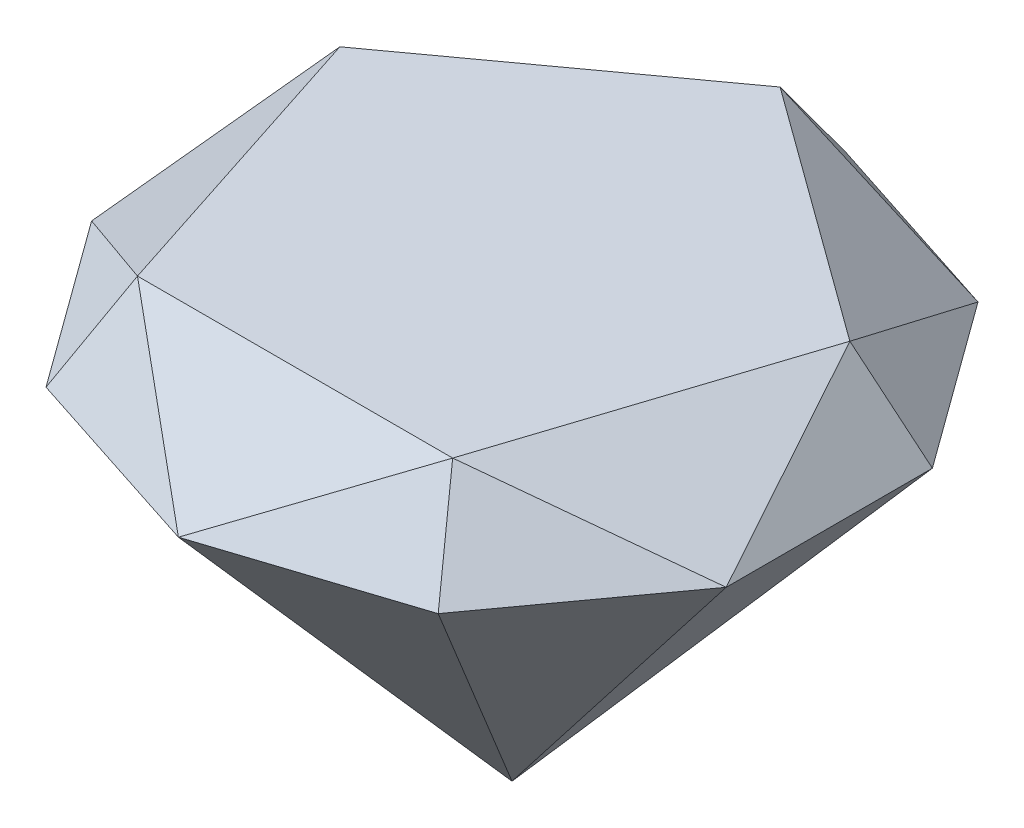
ISO-10303-21;
HEADER;
FILE_DESCRIPTION(('STEP AP214'),'2;1');
FILE_NAME('part.step','',(''),(''),'','','');
FILE_SCHEMA(('AUTOMOTIVE_DESIGN { 1 0 10303 214 1 1 1 1 }'));
ENDSEC;
DATA;
#1=APPLICATION_CONTEXT('core data for automotive mechanical design processes');
#2=APPLICATION_PROTOCOL_DEFINITION('international standard','automotive_design',2000,#1);
#3=PRODUCT_CONTEXT('',#1,'mechanical');
#4=PRODUCT('Part','Part','',(#3));
#5=PRODUCT_RELATED_PRODUCT_CATEGORY('part','',(#4));
#6=PRODUCT_DEFINITION_FORMATION('','',#4);
#7=PRODUCT_DEFINITION_CONTEXT('part definition',#1,'design');
#8=PRODUCT_DEFINITION('design','',#6,#7);
#9=PRODUCT_DEFINITION_SHAPE('','',#8);
#10=(LENGTH_UNIT() NAMED_UNIT(*) SI_UNIT(.MILLI.,.METRE.));
#11=(NAMED_UNIT(*) PLANE_ANGLE_UNIT() SI_UNIT($,.RADIAN.));
#12=(NAMED_UNIT(*) SI_UNIT($,.STERADIAN.) SOLID_ANGLE_UNIT());
#13=UNCERTAINTY_MEASURE_WITH_UNIT(LENGTH_MEASURE(1.E-05),#10,'distance_accuracy_value','');
#14=(GEOMETRIC_REPRESENTATION_CONTEXT(3) GLOBAL_UNCERTAINTY_ASSIGNED_CONTEXT((#13)) GLOBAL_UNIT_ASSIGNED_CONTEXT((#10,
#11,#12)) REPRESENTATION_CONTEXT('',''));
#15=CARTESIAN_POINT('',(0.,0.,0.));
#16=DIRECTION('',(0.,0.,1.));
#17=DIRECTION('',(1.,0.,0.));
#18=AXIS2_PLACEMENT_3D('',#15,#16,#17);
#19=CARTESIAN_POINT('',(-2.41729459493997E-13,85.0068765041162,0.));
#20=DIRECTION('',(0.,-1.,0.));
#21=DIRECTION('',(0.,0.,1.));
#22=AXIS2_PLACEMENT_3D('',#19,#20,#21);
#23=PLANE('',#22);
#24=DIRECTION('',(-0.809016994374936,0.,-0.587785252292489));
#25=VECTOR('',#24,1.);
#26=CARTESIAN_POINT('',(8.99718587698742E-13,85.0068765041162,-60.2751644889123));
#27=LINE('',#26,#25);
#28=CARTESIAN_POINT('',(57.3250879579424,85.0068765041166,-18.6260501658181));
#29=VERTEX_POINT('',#28);
#30=CARTESIAN_POINT('',(8.99718587698742E-13,85.0068765041162,-60.2751644889123));
#31=VERTEX_POINT('',#30);
#32=EDGE_CURVE('E115',#29,#31,#27,.T.);
#33=ORIENTED_EDGE('',*,*,#32,.T.);
#34=DIRECTION('',(-0.809016994374957,0.,0.587785252292459));
#35=VECTOR('',#34,1.);
#36=CARTESIAN_POINT('',(-57.3250879579423,85.0068765041158,-18.6260501658202));
#37=LINE('',#36,#35);
#38=CARTESIAN_POINT('',(-57.3250879579423,85.0068765041158,-18.6260501658201));
#39=VERTEX_POINT('',#38);
#40=EDGE_CURVE('E128',#31,#39,#37,.T.);
#41=ORIENTED_EDGE('',*,*,#40,.T.);
#42=DIRECTION('',(0.309016994374934,0.,0.951056516295158));
#43=VECTOR('',#42,1.);
#44=CARTESIAN_POINT('',(-35.4288527660865,85.006876504116,48.763632410275));
#45=LINE('',#44,#43);
#46=CARTESIAN_POINT('',(-35.4288527660865,85.006876504116,48.763632410275));
#47=VERTEX_POINT('',#46);
#48=EDGE_CURVE('E238',#39,#47,#45,.T.);
#49=ORIENTED_EDGE('',*,*,#48,.T.);
#50=DIRECTION('',(1.,0.,0.));
#51=VECTOR('',#50,1.);
#52=CARTESIAN_POINT('',(35.4288527660849,85.0068765041164,48.7636324102758));
#53=LINE('',#52,#51);
#54=CARTESIAN_POINT('',(35.4288527660849,85.0068765041164,48.7636324102758));
#55=VERTEX_POINT('',#54);
#56=EDGE_CURVE('E151',#47,#55,#53,.T.);
#57=ORIENTED_EDGE('',*,*,#56,.T.);
#58=DIRECTION('',(0.309016994374955,0.,-0.951056516295151));
#59=VECTOR('',#58,1.);
#60=CARTESIAN_POINT('',(57.3250879579422,85.0068765041166,-18.6260501658188));
#61=LINE('',#60,#59);
#62=EDGE_CURVE('E132',#55,#29,#61,.T.);
#63=ORIENTED_EDGE('',*,*,#62,.T.);
#64=EDGE_LOOP('',(#33,#41,#49,#57,#63));
#65=FACE_BOUND('',#64,.T.);
#66=ADVANCED_FACE('F45',(#65),#23,.F.);
#67=CARTESIAN_POINT('',(44.0838939219359,65.0068765041165,-60.6762745781206));
#68=DIRECTION('',(0.662707924806773,0.573576436351051,-0.481485491018295));
#69=DIRECTION('',(-0.654428408218345,0.756123970336084,0.));
#70=AXIS2_PLACEMENT_3D('',#67,#68,#69);
#71=PLANE('',#70);
#72=DIRECTION('',(0.587785252292467,0.,0.809016994374952));
#73=VECTOR('',#72,1.);
#74=CARTESIAN_POINT('',(44.0838939219359,65.0068765041165,-60.6762745781206));
#75=LINE('',#74,#73);
#76=CARTESIAN_POINT('',(44.0838939219359,65.0068765041165,-60.6762745781206));
#77=VERTEX_POINT('',#76);
#78=CARTESIAN_POINT('',(71.3292387221366,65.0068765041167,-23.1762745781205));
#79=VERTEX_POINT('',#78);
#80=EDGE_CURVE('E180',#77,#79,#75,.T.);
#81=ORIENTED_EDGE('',*,*,#80,.F.);
#82=DIRECTION('',(0.273520563799857,0.413135798865409,0.868622652752303));
#83=VECTOR('',#82,1.);
#84=CARTESIAN_POINT('',(57.3250879579424,85.0068765041166,-18.6260501658181));
#85=LINE('',#84,#83);
#86=EDGE_CURVE('E117',#77,#29,#85,.T.);
#87=ORIENTED_EDGE('',*,*,#86,.T.);
#88=DIRECTION('',(0.563867779944973,-0.8052866459945,-0.183211747775237));
#89=VECTOR('',#88,1.);
#90=CARTESIAN_POINT('',(66.5406865874401,71.845637690464,-21.6203796731195));
#91=LINE('',#90,#89);
#92=EDGE_CURVE('E157',#29,#79,#91,.T.);
#93=ORIENTED_EDGE('',*,*,#92,.T.);
#94=EDGE_LOOP('',(#81,#87,#93));
#95=FACE_BOUND('',#94,.T.);
#96=ADVANCED_FACE('F242',(#95),#71,.T.);
#97=CARTESIAN_POINT('',(4.90895196335173E-13,65.0068765041162,-75.));
#98=DIRECTION('',(0.253131902662281,0.573576436351048,-0.779059889557539));
#99=DIRECTION('',(0.,-0.805286645994503,-0.592885670077229));
#100=AXIS2_PLACEMENT_3D('',#97,#98,#99);
#101=PLANE('',#100);
#102=DIRECTION('',(0.,-0.805286645994503,-0.592885670077228));
#103=VECTOR('',#102,1.);
#104=CARTESIAN_POINT('',(3.98347598342526E-13,71.8456376904636,-69.9650183215712));
#105=LINE('',#104,#103);
#106=CARTESIAN_POINT('',(4.90895196335173E-13,65.0068765041162,-75.));
#107=VERTEX_POINT('',#106);
#108=EDGE_CURVE('E147',#31,#107,#105,.T.);
#109=ORIENTED_EDGE('',*,*,#108,.F.);
#110=DIRECTION('',(0.910631736626837,-0.413135798865401,-0.00828564685689326));
#111=VECTOR('',#110,1.);
#112=CARTESIAN_POINT('',(44.0838939219366,65.0068765041165,-60.6762745781202));
#113=LINE('',#112,#111);
#114=EDGE_CURVE('E112',#31,#77,#113,.T.);
#115=ORIENTED_EDGE('',*,*,#114,.T.);
#116=DIRECTION('',(0.951056516295151,0.,0.309016994374956));
#117=VECTOR('',#116,1.);
#118=CARTESIAN_POINT('',(4.90895196335173E-13,65.0068765041162,-75.));
#119=LINE('',#118,#117);
#120=EDGE_CURVE('E155',#107,#77,#119,.T.);
#121=ORIENTED_EDGE('',*,*,#120,.F.);
#122=EDGE_LOOP('',(#109,#115,#121));
#123=FACE_BOUND('',#122,.T.);
#124=ADVANCED_FACE('F153',(#123),#101,.T.);
#125=CARTESIAN_POINT('',(-71.3292387221368,65.0068765041157,23.1762745781204));
#126=DIRECTION('',(-0.819152044288995,0.573576436351041,0.));
#127=DIRECTION('',(-0.573576436351041,-0.819152044288995,0.));
#128=AXIS2_PLACEMENT_3D('',#125,#126,#127);
#129=PLANE('',#128);
#130=DIRECTION('',(0.,0.,-1.));
#131=VECTOR('',#130,1.);
#132=CARTESIAN_POINT('',(-71.3292387221368,65.0068765041157,23.1762745781204));
#133=LINE('',#132,#131);
#134=CARTESIAN_POINT('',(-71.3292387221368,65.0068765041157,23.1762745781204));
#135=VERTEX_POINT('',#134);
#136=CARTESIAN_POINT('',(-71.3292387221364,65.0068765041157,-23.1762745781217));
#137=VERTEX_POINT('',#136);
#138=EDGE_CURVE('E172',#135,#137,#133,.T.);
#139=ORIENTED_EDGE('',*,*,#138,.F.);
#140=DIRECTION('',(0.289280800669858,0.413135798865409,-0.863501841375944));
#141=VECTOR('',#140,1.);
#142=CARTESIAN_POINT('',(-57.3250879579423,85.0068765041158,-18.6260501658201));
#143=LINE('',#142,#141);
#144=EDGE_CURVE('E142',#135,#39,#143,.T.);
#145=ORIENTED_EDGE('',*,*,#144,.T.);
#146=DIRECTION('',(-0.563867779944959,-0.805286645994507,-0.183211747775246));
#147=VECTOR('',#146,1.);
#148=CARTESIAN_POINT('',(-66.54068658744,71.8456376904631,-21.6203796731207));
#149=LINE('',#148,#147);
#150=EDGE_CURVE('E158',#39,#137,#149,.T.);
#151=ORIENTED_EDGE('',*,*,#150,.T.);
#152=EDGE_LOOP('',(#139,#145,#151));
#153=FACE_BOUND('',#152,.T.);
#154=ADVANCED_FACE('F276',(#153),#129,.T.);
#155=CARTESIAN_POINT('',(-44.083893921936,65.0068765041159,60.6762745781207));
#156=DIRECTION('',(-0.662707924806782,0.573576436351042,0.481485491018295));
#157=DIRECTION('',(-0.654428408218334,-0.756123970336093,0.));
#158=AXIS2_PLACEMENT_3D('',#155,#156,#157);
#159=PLANE('',#158);
#160=DIRECTION('',(-0.348489453166934,-0.805286645994506,0.479654582813852));
#161=VECTOR('',#160,1.);
#162=CARTESIAN_POINT('',(-41.1244059457928,71.8456376904633,56.6028888339053));
#163=LINE('',#162,#161);
#164=CARTESIAN_POINT('',(-44.083893921936,65.0068765041159,60.6762745781207));
#165=VERTEX_POINT('',#164);
#166=EDGE_CURVE('E162',#47,#165,#163,.T.);
#167=ORIENTED_EDGE('',*,*,#166,.F.);
#168=DIRECTION('',(-0.741586731576466,-0.413135798865412,-0.528552675942117));
#169=VECTOR('',#168,1.);
#170=CARTESIAN_POINT('',(-71.3292387221369,65.0068765041157,23.1762745781201));
#171=LINE('',#170,#169);
#172=EDGE_CURVE('E236',#47,#135,#171,.T.);
#173=ORIENTED_EDGE('',*,*,#172,.T.);
#174=DIRECTION('',(-0.587785252292467,0.,-0.809016994374952));
#175=VECTOR('',#174,1.);
#176=CARTESIAN_POINT('',(-44.083893921936,65.0068765041159,60.6762745781207));
#177=LINE('',#176,#175);
#178=EDGE_CURVE('E67',#165,#135,#177,.T.);
#179=ORIENTED_EDGE('',*,*,#178,.F.);
#180=EDGE_LOOP('',(#167,#173,#179));
#181=FACE_BOUND('',#180,.T.);
#182=ADVANCED_FACE('F279',(#181),#159,.T.);
#183=CARTESIAN_POINT('',(44.0838939219349,65.0068765041165,60.6762745781214));
#184=DIRECTION('',(0.253131902662267,0.573576436351048,0.779059889557544));
#185=DIRECTION('',(0.,0.805286645994504,-0.592885670077227));
#186=AXIS2_PLACEMENT_3D('',#183,#184,#185);
#187=PLANE('',#186);
#188=DIRECTION('',(0.348489453166937,-0.805286645994501,0.479654582813858));
#189=VECTOR('',#188,1.);
#190=CARTESIAN_POINT('',(41.1244059457916,71.8456376904639,56.602888833906));
#191=LINE('',#190,#189);
#192=CARTESIAN_POINT('',(44.0838939219349,65.0068765041165,60.6762745781214));
#193=VERTEX_POINT('',#192);
#194=EDGE_CURVE('E160',#55,#193,#191,.T.);
#195=ORIENTED_EDGE('',*,*,#194,.F.);
#196=DIRECTION('',(-0.731846369520088,-0.413135798865412,0.541959134175359));
#197=VECTOR('',#196,1.);
#198=CARTESIAN_POINT('',(-9.0698189879351E-13,65.0068765041162,75.));
#199=LINE('',#198,#197);
#200=CARTESIAN_POINT('',(-9.0698189879351E-13,65.0068765041162,75.));
#201=VERTEX_POINT('',#200);
#202=EDGE_CURVE('E230',#55,#201,#199,.T.);
#203=ORIENTED_EDGE('',*,*,#202,.T.);
#204=DIRECTION('',(-0.951056516295156,0.,0.309016994374939));
#205=VECTOR('',#204,1.);
#206=CARTESIAN_POINT('',(44.0838939219349,65.0068765041165,60.6762745781214));
#207=LINE('',#206,#205);
#208=EDGE_CURVE('E166',#193,#201,#207,.T.);
#209=ORIENTED_EDGE('',*,*,#208,.F.);
#210=EDGE_LOOP('',(#195,#203,#209));
#211=FACE_BOUND('',#210,.T.);
#212=ADVANCED_FACE('F281',(#211),#187,.T.);
#213=CARTESIAN_POINT('',(-44.083893921935,65.0068765041159,-60.6762745781215));
#214=DIRECTION('',(-0.253131902662276,0.573576436351045,-0.779059889557544));
#215=DIRECTION('',(0.,-0.805286645994504,-0.592885670077227));
#216=AXIS2_PLACEMENT_3D('',#213,#214,#215);
#217=PLANE('',#216);
#218=DIRECTION('',(0.951056516295156,0.,-0.30901699437494));
#219=VECTOR('',#218,1.);
#220=CARTESIAN_POINT('',(-44.083893921935,65.0068765041159,-60.6762745781215));
#221=LINE('',#220,#219);
#222=CARTESIAN_POINT('',(-44.083893921935,65.0068765041159,-60.6762745781215));
#223=VERTEX_POINT('',#222);
#224=EDGE_CURVE('E149',#223,#107,#221,.T.);
#225=ORIENTED_EDGE('',*,*,#224,.F.);
#226=DIRECTION('',(0.910631736626832,0.413135798865413,0.00828564685692673));
#227=VECTOR('',#226,1.);
#228=CARTESIAN_POINT('',(7.95635179140134E-13,85.0068765041162,-60.2751644889123));
#229=LINE('',#228,#227);
#230=EDGE_CURVE('E139',#223,#31,#229,.T.);
#231=ORIENTED_EDGE('',*,*,#230,.T.);
#232=ORIENTED_EDGE('',*,*,#108,.T.);
#233=EDGE_LOOP('',(#225,#231,#232));
#234=FACE_BOUND('',#233,.T.);
#235=ADVANCED_FACE('F146',(#234),#217,.T.);
#236=CARTESIAN_POINT('',(-71.3292387221364,65.0068765041157,-23.1762745781217));
#237=DIRECTION('',(-0.662707924806774,0.573576436351042,-0.481485491018305));
#238=DIRECTION('',(-0.654428408218338,-0.75612397033609,0.));
#239=AXIS2_PLACEMENT_3D('',#236,#237,#238);
#240=PLANE('',#239);
#241=ORIENTED_EDGE('',*,*,#150,.F.);
#242=DIRECTION('',(0.273520563799895,-0.413135798865405,-0.868622652752293));
#243=VECTOR('',#242,1.);
#244=CARTESIAN_POINT('',(-44.0838939219346,65.0068765041159,-60.6762745781218));
#245=LINE('',#244,#243);
#246=EDGE_CURVE('E141',#39,#223,#245,.T.);
#247=ORIENTED_EDGE('',*,*,#246,.T.);
#248=DIRECTION('',(0.58778525229248,0.,-0.809016994374943));
#249=VECTOR('',#248,1.);
#250=CARTESIAN_POINT('',(-71.3292387221364,65.0068765041157,-23.1762745781217));
#251=LINE('',#250,#249);
#252=EDGE_CURVE('E175',#137,#223,#251,.T.);
#253=ORIENTED_EDGE('',*,*,#252,.F.);
#254=EDGE_LOOP('',(#241,#247,#253));
#255=FACE_BOUND('',#254,.T.);
#256=ADVANCED_FACE('F273',(#255),#240,.T.);
#257=CARTESIAN_POINT('',(-7.21685738655062E-13,65.0068765041162,75.));
#258=DIRECTION('',(-0.253131902662289,0.573576436351045,0.779059889557539));
#259=DIRECTION('',(0.,0.805286645994503,-0.592885670077229));
#260=AXIS2_PLACEMENT_3D('',#257,#258,#259);
#261=PLANE('',#260);
#262=DIRECTION('',(-0.951056516295151,0.,-0.309016994374956));
#263=VECTOR('',#262,1.);
#264=CARTESIAN_POINT('',(-7.21685738655062E-13,65.0068765041162,75.));
#265=LINE('',#264,#263);
#266=EDGE_CURVE('E169',#201,#165,#265,.T.);
#267=ORIENTED_EDGE('',*,*,#266,.F.);
#268=DIRECTION('',(-0.731846369520082,0.413135798865402,-0.541959134175376));
#269=VECTOR('',#268,1.);
#270=CARTESIAN_POINT('',(-35.4288527660864,85.006876504116,48.763632410275));
#271=LINE('',#270,#269);
#272=EDGE_CURVE('E218',#201,#47,#271,.T.);
#273=ORIENTED_EDGE('',*,*,#272,.T.);
#274=ORIENTED_EDGE('',*,*,#166,.T.);
#275=EDGE_LOOP('',(#267,#273,#274));
#276=FACE_BOUND('',#275,.T.);
#277=ADVANCED_FACE('F217',(#276),#261,.T.);
#278=CARTESIAN_POINT('',(71.3292387221362,65.0068765041167,23.1762745781216));
#279=DIRECTION('',(0.662707924806765,0.573576436351051,0.481485491018306));
#280=DIRECTION('',(-0.654428408218349,0.75612397033608,0.));
#281=AXIS2_PLACEMENT_3D('',#278,#279,#280);
#282=PLANE('',#281);
#283=DIRECTION('',(-0.58778525229248,0.,0.809016994374942));
#284=VECTOR('',#283,1.);
#285=CARTESIAN_POINT('',(71.3292387221362,65.0068765041167,23.1762745781216));
#286=LINE('',#285,#284);
#287=CARTESIAN_POINT('',(71.3292387221362,65.0068765041167,23.1762745781216));
#288=VERTEX_POINT('',#287);
#289=EDGE_CURVE('E186',#288,#193,#286,.T.);
#290=ORIENTED_EDGE('',*,*,#289,.F.);
#291=DIRECTION('',(-0.741586731576484,0.413135798865402,0.5285526759421));
#292=VECTOR('',#291,1.);
#293=CARTESIAN_POINT('',(35.428852766085,85.0068765041164,48.7636324102757));
#294=LINE('',#293,#292);
#295=EDGE_CURVE('E219',#288,#55,#294,.T.);
#296=ORIENTED_EDGE('',*,*,#295,.T.);
#297=ORIENTED_EDGE('',*,*,#194,.T.);
#298=EDGE_LOOP('',(#290,#296,#297));
#299=FACE_BOUND('',#298,.T.);
#300=ADVANCED_FACE('F250',(#299),#282,.T.);
#301=CARTESIAN_POINT('',(71.3292387221366,65.0068765041167,-23.1762745781205));
#302=DIRECTION('',(0.819152044288987,0.573576436351052,0.));
#303=DIRECTION('',(-0.573576436351052,0.819152044288987,0.));
#304=AXIS2_PLACEMENT_3D('',#301,#302,#303);
#305=PLANE('',#304);
#306=ORIENTED_EDGE('',*,*,#92,.F.);
#307=DIRECTION('',(0.289280800669845,-0.413135798865405,0.86350184137595));
#308=VECTOR('',#307,1.);
#309=CARTESIAN_POINT('',(71.3292387221362,65.0068765041167,23.1762745781216));
#310=LINE('',#309,#308);
#311=EDGE_CURVE('E221',#29,#288,#310,.T.);
#312=ORIENTED_EDGE('',*,*,#311,.T.);
#313=DIRECTION('',(0.,0.,1.));
#314=VECTOR('',#313,1.);
#315=CARTESIAN_POINT('',(71.3292387221366,65.0068765041167,-23.1762745781205));
#316=LINE('',#315,#314);
#317=EDGE_CURVE('E183',#79,#288,#316,.T.);
#318=ORIENTED_EDGE('',*,*,#317,.F.);
#319=EDGE_LOOP('',(#306,#312,#318));
#320=FACE_BOUND('',#319,.T.);
#321=ADVANCED_FACE('F248',(#320),#305,.T.);
#322=CARTESIAN_POINT('',(44.0838939219349,65.0068765041165,60.6762745781214));
#323=DIRECTION('',(0.236720751370255,-0.642787609686538,0.728551559399998));
#324=DIRECTION('',(0.,0.749864407895273,0.661591543002079));
#325=AXIS2_PLACEMENT_3D('',#322,#323,#324);
#326=PLANE('',#325);
#327=ORIENTED_EDGE('',*,*,#208,.T.);
#328=DIRECTION('',(0.,0.749864407895272,0.66159154300208));
#329=VECTOR('',#328,1.);
#330=CARTESIAN_POINT('',(-7.18021667241941E-13,65.0068765041162,75.));
#331=LINE('',#330,#329);
#332=CARTESIAN_POINT('',(5.54715029314804E-13,-20.,0.));
#333=VERTEX_POINT('',#332);
#334=EDGE_CURVE('E11',#333,#201,#331,.T.);
#335=ORIENTED_EDGE('',*,*,#334,.F.);
#336=DIRECTION('',(0.388873752018034,0.749864407895275,0.53523880162343));
#337=VECTOR('',#336,1.);
#338=CARTESIAN_POINT('',(44.0838939219349,65.0068765041165,60.6762745781214));
#339=LINE('',#338,#337);
#340=EDGE_CURVE('E188',#333,#193,#339,.T.);
#341=ORIENTED_EDGE('',*,*,#340,.T.);
#342=EDGE_LOOP('',(#327,#335,#341));
#343=FACE_BOUND('',#342,.T.);
#344=ADVANCED_FACE('F314',(#343),#326,.T.);
#345=CARTESIAN_POINT('',(-7.21685738655062E-13,65.0068765041162,75.));
#346=DIRECTION('',(-0.236720751370259,-0.642787609686541,0.728551559399994));
#347=DIRECTION('',(0.,0.749864407895271,0.661591543002081));
#348=AXIS2_PLACEMENT_3D('',#345,#346,#347);
#349=PLANE('',#348);
#350=ORIENTED_EDGE('',*,*,#266,.T.);
#351=DIRECTION('',(-0.388873752018054,0.74986440789527,0.535238801623423));
#352=VECTOR('',#351,1.);
#353=CARTESIAN_POINT('',(-44.083893921936,65.0068765041159,60.6762745781207));
#354=LINE('',#353,#352);
#355=EDGE_CURVE('E49',#333,#165,#354,.T.);
#356=ORIENTED_EDGE('',*,*,#355,.F.);
#357=ORIENTED_EDGE('',*,*,#334,.T.);
#358=EDGE_LOOP('',(#350,#356,#357));
#359=FACE_BOUND('',#358,.T.);
#360=ADVANCED_FACE('F47',(#359),#349,.T.);
#361=CARTESIAN_POINT('',(-44.083893921936,65.0068765041159,60.6762745781207));
#362=DIRECTION('',(-0.619742972929745,-0.642787609686544,0.45026962626593));
#363=DIRECTION('',(0.719893503497967,-0.694084536365292,0.));
#364=AXIS2_PLACEMENT_3D('',#361,#362,#363);
#365=PLANE('',#364);
#366=ORIENTED_EDGE('',*,*,#178,.T.);
#367=DIRECTION('',(-0.6292109480979,0.749864407895268,0.204443030122381));
#368=VECTOR('',#367,1.);
#369=CARTESIAN_POINT('',(-71.3292387221368,65.0068765041157,23.1762745781204));
#370=LINE('',#369,#368);
#371=EDGE_CURVE('E207',#333,#135,#370,.T.);
#372=ORIENTED_EDGE('',*,*,#371,.F.);
#373=ORIENTED_EDGE('',*,*,#355,.T.);
#374=EDGE_LOOP('',(#366,#372,#373));
#375=FACE_BOUND('',#374,.T.);
#376=ADVANCED_FACE('F212',(#375),#365,.T.);
#377=CARTESIAN_POINT('',(-71.3292387221368,65.0068765041157,23.1762745781204));
#378=DIRECTION('',(-0.766044443118973,-0.642787609686545,0.));
#379=DIRECTION('',(0.642787609686545,-0.766044443118973,0.));
#380=AXIS2_PLACEMENT_3D('',#377,#378,#379);
#381=PLANE('',#380);
#382=ORIENTED_EDGE('',*,*,#138,.T.);
#383=DIRECTION('',(-0.629210948097897,0.749864407895268,-0.204443030122392));
#384=VECTOR('',#383,1.);
#385=CARTESIAN_POINT('',(-71.3292387221364,65.0068765041157,-23.1762745781217));
#386=LINE('',#385,#384);
#387=EDGE_CURVE('E205',#333,#137,#386,.T.);
#388=ORIENTED_EDGE('',*,*,#387,.F.);
#389=ORIENTED_EDGE('',*,*,#371,.T.);
#390=EDGE_LOOP('',(#382,#388,#389));
#391=FACE_BOUND('',#390,.T.);
#392=ADVANCED_FACE('F331',(#391),#381,.T.);
#393=CARTESIAN_POINT('',(-71.3292387221364,65.0068765041157,-23.1762745781217));
#394=DIRECTION('',(-0.619742972929738,-0.642787609686544,-0.45026962626594));
#395=DIRECTION('',(0.719893503497971,-0.694084536365288,0.));
#396=AXIS2_PLACEMENT_3D('',#393,#394,#395);
#397=PLANE('',#396);
#398=ORIENTED_EDGE('',*,*,#252,.T.);
#399=DIRECTION('',(-0.388873752018045,0.74986440789527,-0.535238801623429));
#400=VECTOR('',#399,1.);
#401=CARTESIAN_POINT('',(-44.083893921935,65.0068765041159,-60.6762745781215));
#402=LINE('',#401,#400);
#403=EDGE_CURVE('E203',#333,#223,#402,.T.);
#404=ORIENTED_EDGE('',*,*,#403,.F.);
#405=ORIENTED_EDGE('',*,*,#387,.T.);
#406=EDGE_LOOP('',(#398,#404,#405));
#407=FACE_BOUND('',#406,.T.);
#408=ADVANCED_FACE('F271',(#407),#397,.T.);
#409=CARTESIAN_POINT('',(-44.083893921935,65.0068765041159,-60.6762745781215));
#410=DIRECTION('',(-0.236720751370247,-0.642787609686541,-0.728551559399998));
#411=DIRECTION('',(0.,-0.749864407895273,0.661591543002079));
#412=AXIS2_PLACEMENT_3D('',#409,#410,#411);
#413=PLANE('',#412);
#414=ORIENTED_EDGE('',*,*,#224,.T.);
#415=DIRECTION('',(0.,0.749864407895272,-0.66159154300208));
#416=VECTOR('',#415,1.);
#417=CARTESIAN_POINT('',(4.90895196335173E-13,65.0068765041162,-75.));
#418=LINE('',#417,#416);
#419=EDGE_CURVE('E201',#333,#107,#418,.T.);
#420=ORIENTED_EDGE('',*,*,#419,.F.);
#421=ORIENTED_EDGE('',*,*,#403,.T.);
#422=EDGE_LOOP('',(#414,#420,#421));
#423=FACE_BOUND('',#422,.T.);
#424=ADVANCED_FACE('F267',(#423),#413,.T.);
#425=CARTESIAN_POINT('',(4.90895196335173E-13,65.0068765041162,-75.));
#426=DIRECTION('',(0.236720751370268,-0.642787609686538,-0.728551559399993));
#427=DIRECTION('',(0.,-0.749864407895271,0.661591543002081));
#428=AXIS2_PLACEMENT_3D('',#425,#426,#427);
#429=PLANE('',#428);
#430=ORIENTED_EDGE('',*,*,#120,.T.);
#431=DIRECTION('',(0.388873752018043,0.749864407895275,-0.535238801623423));
#432=VECTOR('',#431,1.);
#433=CARTESIAN_POINT('',(44.0838939219359,65.0068765041165,-60.6762745781206));
#434=LINE('',#433,#432);
#435=EDGE_CURVE('E198',#333,#77,#434,.T.);
#436=ORIENTED_EDGE('',*,*,#435,.F.);
#437=ORIENTED_EDGE('',*,*,#419,.T.);
#438=EDGE_LOOP('',(#430,#436,#437));
#439=FACE_BOUND('',#438,.T.);
#440=ADVANCED_FACE('F264',(#439),#429,.T.);
#441=CARTESIAN_POINT('',(44.0838939219359,65.0068765041165,-60.6762745781206));
#442=DIRECTION('',(0.619742972929753,-0.642787609686535,-0.450269626265931));
#443=DIRECTION('',(0.719893503497957,0.694084536365302,0.));
#444=AXIS2_PLACEMENT_3D('',#441,#442,#443);
#445=PLANE('',#444);
#446=ORIENTED_EDGE('',*,*,#80,.T.);
#447=DIRECTION('',(0.62921094809789,0.749864407895277,-0.204443030122382));
#448=VECTOR('',#447,1.);
#449=CARTESIAN_POINT('',(71.3292387221366,65.0068765041167,-23.1762745781205));
#450=LINE('',#449,#448);
#451=EDGE_CURVE('E195',#333,#79,#450,.T.);
#452=ORIENTED_EDGE('',*,*,#451,.F.);
#453=ORIENTED_EDGE('',*,*,#435,.T.);
#454=EDGE_LOOP('',(#446,#452,#453));
#455=FACE_BOUND('',#454,.T.);
#456=ADVANCED_FACE('F261',(#455),#445,.T.);
#457=CARTESIAN_POINT('',(71.3292387221366,65.0068765041167,-23.1762745781205));
#458=DIRECTION('',(0.766044443118982,-0.642787609686534,0.));
#459=DIRECTION('',(0.642787609686534,0.766044443118982,0.));
#460=AXIS2_PLACEMENT_3D('',#457,#458,#459);
#461=PLANE('',#460);
#462=ORIENTED_EDGE('',*,*,#317,.T.);
#463=DIRECTION('',(0.629210948097886,0.749864407895277,0.204443030122392));
#464=VECTOR('',#463,1.);
#465=CARTESIAN_POINT('',(71.3292387221362,65.0068765041167,23.1762745781216));
#466=LINE('',#465,#464);
#467=EDGE_CURVE('E192',#333,#288,#466,.T.);
#468=ORIENTED_EDGE('',*,*,#467,.F.);
#469=ORIENTED_EDGE('',*,*,#451,.T.);
#470=EDGE_LOOP('',(#462,#468,#469));
#471=FACE_BOUND('',#470,.T.);
#472=ADVANCED_FACE('F258',(#471),#461,.T.);
#473=CARTESIAN_POINT('',(71.3292387221362,65.0068765041167,23.1762745781216));
#474=DIRECTION('',(0.619742972929746,-0.642787609686535,0.450269626265941));
#475=DIRECTION('',(0.719893503497961,0.694084536365298,0.));
#476=AXIS2_PLACEMENT_3D('',#473,#474,#475);
#477=PLANE('',#476);
#478=ORIENTED_EDGE('',*,*,#289,.T.);
#479=ORIENTED_EDGE('',*,*,#340,.F.);
#480=ORIENTED_EDGE('',*,*,#467,.T.);
#481=EDGE_LOOP('',(#478,#479,#480));
#482=FACE_BOUND('',#481,.T.);
#483=ADVANCED_FACE('F256',(#482),#477,.T.);
#484=CARTESIAN_POINT('',(26.2156241532864,101.166807070548,8.51797263644223));
#485=DIRECTION('',(0.57657078408729,0.795279921520224,0.187339204022418));
#486=DIRECTION('',(-0.809613906770432,0.586962794360868,0.));
#487=AXIS2_PLACEMENT_3D('',#484,#485,#486);
#488=PLANE('',#487);
#489=ORIENTED_EDGE('',*,*,#62,.F.);
#490=ORIENTED_EDGE('',*,*,#295,.F.);
#491=ORIENTED_EDGE('',*,*,#311,.F.);
#492=EDGE_LOOP('',(#489,#490,#491));
#493=FACE_BOUND('',#492,.T.);
#494=ADVANCED_FACE('F245',(#493),#488,.T.);
#495=CARTESIAN_POINT('',(-6.6335443023726E-13,101.166807070548,27.5647384820094));
#496=DIRECTION('',(0.,0.79527992152022,0.606242399067232));
#497=DIRECTION('',(-0.250184456074358,0.586962794360872,-0.769988581717193));
#498=AXIS2_PLACEMENT_3D('',#495,#496,#497);
#499=PLANE('',#498);
#500=ORIENTED_EDGE('',*,*,#56,.F.);
#501=ORIENTED_EDGE('',*,*,#272,.F.);
#502=ORIENTED_EDGE('',*,*,#202,.F.);
#503=EDGE_LOOP('',(#500,#501,#502));
#504=FACE_BOUND('',#503,.T.);
#505=ADVANCED_FACE('F451',(#504),#499,.T.);
#506=CARTESIAN_POINT('',(-16.2021467630239,101.166807070547,-22.300341877447));
#507=DIRECTION('',(-0.356340341486124,0.795279921520218,-0.490460403556035));
#508=DIRECTION('',(0.654991409459562,0.586962794360878,0.475879114450556));
#509=AXIS2_PLACEMENT_3D('',#506,#507,#508);
#510=PLANE('',#509);
#511=ORIENTED_EDGE('',*,*,#40,.F.);
#512=ORIENTED_EDGE('',*,*,#230,.F.);
#513=ORIENTED_EDGE('',*,*,#246,.F.);
#514=EDGE_LOOP('',(#511,#512,#513));
#515=FACE_BOUND('',#514,.T.);
#516=ADVANCED_FACE('F138',(#515),#510,.T.);
#517=CARTESIAN_POINT('',(-26.2156241532873,101.166807070547,8.51797263644164));
#518=DIRECTION('',(-0.576570784087306,0.795279921520216,0.187339204022405));
#519=DIRECTION('',(0.654991409459569,0.586962794360878,-0.475879114450547));
#520=AXIS2_PLACEMENT_3D('',#517,#518,#519);
#521=PLANE('',#520);
#522=ORIENTED_EDGE('',*,*,#48,.F.);
#523=ORIENTED_EDGE('',*,*,#144,.F.);
#524=ORIENTED_EDGE('',*,*,#172,.F.);
#525=EDGE_LOOP('',(#522,#523,#524));
#526=FACE_BOUND('',#525,.T.);
#527=ADVANCED_FACE('F278',(#526),#521,.T.);
#528=CARTESIAN_POINT('',(16.202146763024,101.166807070548,-22.3003418774464));
#529=DIRECTION('',(0.356340341486131,0.795279921520223,-0.490460403556022));
#530=DIRECTION('',(-0.250184456074369,0.586962794360872,0.769988581717189));
#531=AXIS2_PLACEMENT_3D('',#528,#529,#530);
#532=PLANE('',#531);
#533=ORIENTED_EDGE('',*,*,#32,.F.);
#534=ORIENTED_EDGE('',*,*,#86,.F.);
#535=ORIENTED_EDGE('',*,*,#114,.F.);
#536=EDGE_LOOP('',(#533,#534,#535));
#537=FACE_BOUND('',#536,.T.);
#538=ADVANCED_FACE('F114',(#537),#532,.T.);
#539=CLOSED_SHELL('',(#66,#96,#124,#154,#182,#212,#235,#256,#277,#300,#321,#344,#360,#376,#392,
#408,#424,#440,#456,#472,#483,#494,#505,#516,#527,#538));
#540=MANIFOLD_SOLID_BREP('B2',#539);
#541=ADVANCED_BREP_SHAPE_REPRESENTATION('',(#18,#540),#14);
#542=SHAPE_DEFINITION_REPRESENTATION(#9,#541);
ENDSEC;
END-ISO-10303-21;
